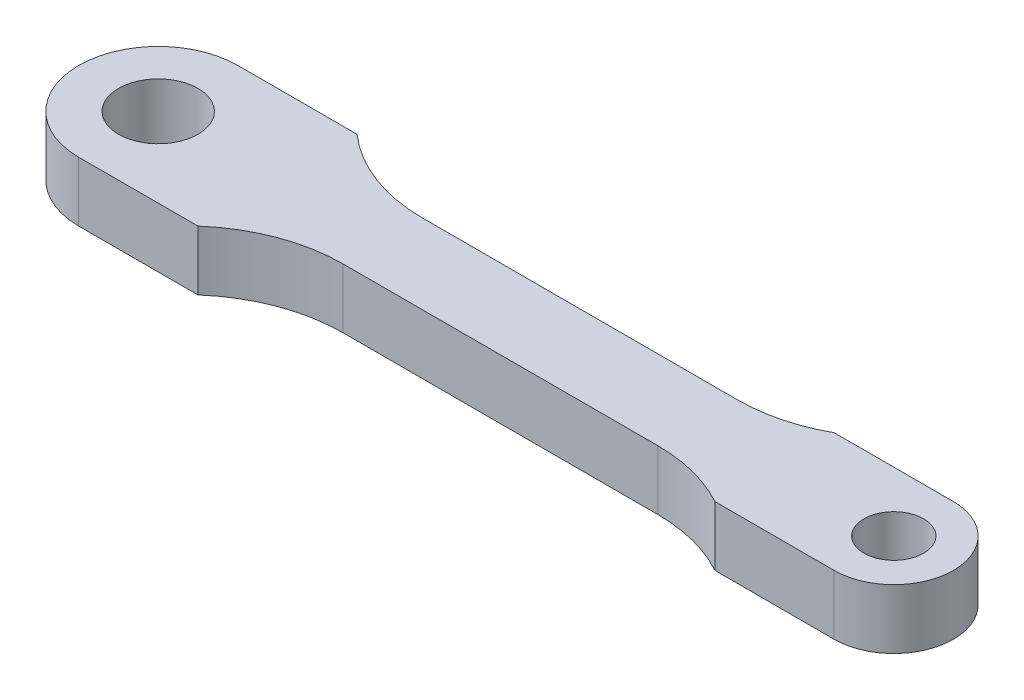
ISO-10303-21;
HEADER;
FILE_DESCRIPTION(('STEP AP214'),'2;1');
FILE_NAME('part.step','',(''),(''),'','','');
FILE_SCHEMA(('AUTOMOTIVE_DESIGN { 1 0 10303 214 1 1 1 1 }'));
ENDSEC;
DATA;
#1=APPLICATION_CONTEXT('core data for automotive mechanical design processes');
#2=APPLICATION_PROTOCOL_DEFINITION('international standard','automotive_design',2000,#1);
#3=PRODUCT_CONTEXT('',#1,'mechanical');
#4=PRODUCT('Part','Part','',(#3));
#5=PRODUCT_RELATED_PRODUCT_CATEGORY('part','',(#4));
#6=PRODUCT_DEFINITION_FORMATION('','',#4);
#7=PRODUCT_DEFINITION_CONTEXT('part definition',#1,'design');
#8=PRODUCT_DEFINITION('design','',#6,#7);
#9=PRODUCT_DEFINITION_SHAPE('','',#8);
#10=(LENGTH_UNIT() NAMED_UNIT(*) SI_UNIT(.MILLI.,.METRE.));
#11=(NAMED_UNIT(*) PLANE_ANGLE_UNIT() SI_UNIT($,.RADIAN.));
#12=(NAMED_UNIT(*) SI_UNIT($,.STERADIAN.) SOLID_ANGLE_UNIT());
#13=UNCERTAINTY_MEASURE_WITH_UNIT(LENGTH_MEASURE(1.E-05),#10,'distance_accuracy_value','');
#14=(GEOMETRIC_REPRESENTATION_CONTEXT(3) GLOBAL_UNCERTAINTY_ASSIGNED_CONTEXT((#13)) GLOBAL_UNIT_ASSIGNED_CONTEXT((#10,
#11,#12)) REPRESENTATION_CONTEXT('',''));
#15=CARTESIAN_POINT('',(0.,0.,0.));
#16=DIRECTION('',(0.,0.,1.));
#17=DIRECTION('',(1.,0.,0.));
#18=AXIS2_PLACEMENT_3D('',#15,#16,#17);
#19=CARTESIAN_POINT('',(0.841204780445638,2.25,4.5));
#20=DIRECTION('',(0.,0.,1.));
#21=DIRECTION('',(1.,0.,0.));
#22=AXIS2_PLACEMENT_3D('',#19,#20,#21);
#23=PLANE('',#22);
#24=DIRECTION('',(-1.,0.,0.));
#25=VECTOR('',#24,1.);
#26=CARTESIAN_POINT('',(0.841204780445638,-2.25,4.5));
#27=LINE('',#26,#25);
#28=CARTESIAN_POINT('',(28.5912047804456,-2.25,4.5));
#29=VERTEX_POINT('',#28);
#30=CARTESIAN_POINT('',(19.5912047804456,-2.25,4.5));
#31=VERTEX_POINT('',#30);
#32=EDGE_CURVE('E162',#29,#31,#27,.T.);
#33=ORIENTED_EDGE('',*,*,#32,.F.);
#34=DIRECTION('',(0.,-1.,0.));
#35=VECTOR('',#34,1.);
#36=CARTESIAN_POINT('',(28.5912047804456,2.25,4.5));
#37=LINE('',#36,#35);
#38=CARTESIAN_POINT('',(28.5912047804456,2.25,4.5));
#39=VERTEX_POINT('',#38);
#40=EDGE_CURVE('E11',#39,#29,#37,.T.);
#41=ORIENTED_EDGE('',*,*,#40,.F.);
#42=DIRECTION('',(-1.,0.,0.));
#43=VECTOR('',#42,1.);
#44=CARTESIAN_POINT('',(0.841204780445638,2.25,4.5));
#45=LINE('',#44,#43);
#46=CARTESIAN_POINT('',(19.5912047804456,2.25,4.5));
#47=VERTEX_POINT('',#46);
#48=EDGE_CURVE('E196',#39,#47,#45,.T.);
#49=ORIENTED_EDGE('',*,*,#48,.T.);
#50=DIRECTION('',(0.,-1.,0.));
#51=VECTOR('',#50,1.);
#52=CARTESIAN_POINT('',(19.5912047804456,2.25,4.5));
#53=LINE('',#52,#51);
#54=EDGE_CURVE('E53',#47,#31,#53,.T.);
#55=ORIENTED_EDGE('',*,*,#54,.T.);
#56=EDGE_LOOP('',(#33,#41,#49,#55));
#57=FACE_BOUND('',#56,.T.);
#58=ADVANCED_FACE('F37',(#57),#23,.T.);
#59=CARTESIAN_POINT('',(28.5912047804456,2.25,0.));
#60=DIRECTION('',(0.,-1.,0.));
#61=DIRECTION('',(0.,0.,-1.));
#62=AXIS2_PLACEMENT_3D('',#59,#60,#61);
#63=CYLINDRICAL_SURFACE('',#62,4.5);
#64=CARTESIAN_POINT('',(28.5912047804456,-2.25,0.));
#65=DIRECTION('',(0.,1.,0.));
#66=DIRECTION('',(0.,0.,1.));
#67=AXIS2_PLACEMENT_3D('',#64,#65,#66);
#68=CIRCLE('',#67,4.5);
#69=CARTESIAN_POINT('',(28.5912047804456,-2.25,-4.5));
#70=VERTEX_POINT('',#69);
#71=EDGE_CURVE('E164',#29,#70,#68,.T.);
#72=ORIENTED_EDGE('',*,*,#71,.T.);
#73=DIRECTION('',(0.,-1.,0.));
#74=VECTOR('',#73,1.);
#75=CARTESIAN_POINT('',(28.5912047804456,2.25,-4.5));
#76=LINE('',#75,#74);
#77=CARTESIAN_POINT('',(28.5912047804456,2.25,-4.5));
#78=VERTEX_POINT('',#77);
#79=EDGE_CURVE('E45',#78,#70,#76,.T.);
#80=ORIENTED_EDGE('',*,*,#79,.F.);
#81=CARTESIAN_POINT('',(28.5912047804456,2.25,0.));
#82=DIRECTION('',(0.,1.,0.));
#83=DIRECTION('',(0.,0.,1.));
#84=AXIS2_PLACEMENT_3D('',#81,#82,#83);
#85=CIRCLE('',#84,4.5);
#86=EDGE_CURVE('E239',#39,#78,#85,.T.);
#87=ORIENTED_EDGE('',*,*,#86,.F.);
#88=ORIENTED_EDGE('',*,*,#40,.T.);
#89=EDGE_LOOP('',(#72,#80,#87,#88));
#90=FACE_BOUND('',#89,.T.);
#91=ADVANCED_FACE('F274',(#90),#63,.T.);
#92=CARTESIAN_POINT('',(0.841204780445638,2.25,-4.5));
#93=DIRECTION('',(0.,0.,1.));
#94=DIRECTION('',(1.,0.,0.));
#95=AXIS2_PLACEMENT_3D('',#92,#93,#94);
#96=PLANE('',#95);
#97=DIRECTION('',(-1.,0.,0.));
#98=VECTOR('',#97,1.);
#99=CARTESIAN_POINT('',(0.841204780445638,-2.25,-4.5));
#100=LINE('',#99,#98);
#101=CARTESIAN_POINT('',(19.5912047804456,-2.25,-4.5));
#102=VERTEX_POINT('',#101);
#103=EDGE_CURVE('E166',#70,#102,#100,.T.);
#104=ORIENTED_EDGE('',*,*,#103,.T.);
#105=DIRECTION('',(0.,-1.,0.));
#106=VECTOR('',#105,1.);
#107=CARTESIAN_POINT('',(19.5912047804456,2.25,-4.5));
#108=LINE('',#107,#106);
#109=CARTESIAN_POINT('',(19.5912047804456,2.25,-4.5));
#110=VERTEX_POINT('',#109);
#111=EDGE_CURVE('E211',#110,#102,#108,.T.);
#112=ORIENTED_EDGE('',*,*,#111,.F.);
#113=DIRECTION('',(-1.,0.,0.));
#114=VECTOR('',#113,1.);
#115=CARTESIAN_POINT('',(0.841204780445638,2.25,-4.5));
#116=LINE('',#115,#114);
#117=EDGE_CURVE('E220',#78,#110,#116,.T.);
#118=ORIENTED_EDGE('',*,*,#117,.F.);
#119=ORIENTED_EDGE('',*,*,#79,.T.);
#120=EDGE_LOOP('',(#104,#112,#118,#119));
#121=FACE_BOUND('',#120,.T.);
#122=ADVANCED_FACE('F218',(#121),#96,.F.);
#123=CARTESIAN_POINT('',(13.7817297611345,2.25,-15.));
#124=DIRECTION('',(0.,-1.,0.));
#125=DIRECTION('',(0.,0.,-1.));
#126=AXIS2_PLACEMENT_3D('',#123,#124,#125);
#127=CYLINDRICAL_SURFACE('',#126,12.);
#128=CARTESIAN_POINT('',(13.7817297611345,-2.25,-15.));
#129=DIRECTION('',(0.,1.,0.));
#130=DIRECTION('',(0.,0.,1.));
#131=AXIS2_PLACEMENT_3D('',#128,#129,#130);
#132=CIRCLE('',#131,12.);
#133=CARTESIAN_POINT('',(13.7817297611345,-2.25,-3.));
#134=VERTEX_POINT('',#133);
#135=EDGE_CURVE('E168',#102,#134,#132,.F.);
#136=ORIENTED_EDGE('',*,*,#135,.T.);
#137=DIRECTION('',(0.,-1.,0.));
#138=VECTOR('',#137,1.);
#139=CARTESIAN_POINT('',(13.7817297611345,2.25,-3.));
#140=LINE('',#139,#138);
#141=CARTESIAN_POINT('',(13.7817297611345,2.25,-3.));
#142=VERTEX_POINT('',#141);
#143=EDGE_CURVE('E209',#142,#134,#140,.T.);
#144=ORIENTED_EDGE('',*,*,#143,.F.);
#145=CARTESIAN_POINT('',(13.7817297611345,2.25,-15.));
#146=DIRECTION('',(0.,1.,0.));
#147=DIRECTION('',(0.,0.,1.));
#148=AXIS2_PLACEMENT_3D('',#145,#146,#147);
#149=CIRCLE('',#148,12.);
#150=EDGE_CURVE('E233',#110,#142,#149,.F.);
#151=ORIENTED_EDGE('',*,*,#150,.F.);
#152=ORIENTED_EDGE('',*,*,#111,.T.);
#153=EDGE_LOOP('',(#136,#144,#151,#152));
#154=FACE_BOUND('',#153,.T.);
#155=ADVANCED_FACE('F230',(#154),#127,.F.);
#156=CARTESIAN_POINT('',(0.841204780445639,2.25,-3.));
#157=DIRECTION('',(0.,0.,-1.));
#158=DIRECTION('',(-1.,0.,0.));
#159=AXIS2_PLACEMENT_3D('',#156,#157,#158);
#160=PLANE('',#159);
#161=DIRECTION('',(1.,0.,0.));
#162=VECTOR('',#161,1.);
#163=CARTESIAN_POINT('',(0.841204780445639,-2.25,-3.));
#164=LINE('',#163,#162);
#165=CARTESIAN_POINT('',(-9.97154128636059,-2.25,-3.));
#166=VERTEX_POINT('',#165);
#167=EDGE_CURVE('E171',#166,#134,#164,.T.);
#168=ORIENTED_EDGE('',*,*,#167,.F.);
#169=DIRECTION('',(0.,-1.,0.));
#170=VECTOR('',#169,1.);
#171=CARTESIAN_POINT('',(-9.97154128636059,2.25,-3.));
#172=LINE('',#171,#170);
#173=CARTESIAN_POINT('',(-9.97154128636059,2.25,-3.));
#174=VERTEX_POINT('',#173);
#175=EDGE_CURVE('E207',#174,#166,#172,.T.);
#176=ORIENTED_EDGE('',*,*,#175,.F.);
#177=DIRECTION('',(1.,0.,0.));
#178=VECTOR('',#177,1.);
#179=CARTESIAN_POINT('',(0.841204780445639,2.25,-3.));
#180=LINE('',#179,#178);
#181=EDGE_CURVE('E235',#174,#142,#180,.T.);
#182=ORIENTED_EDGE('',*,*,#181,.T.);
#183=ORIENTED_EDGE('',*,*,#143,.T.);
#184=EDGE_LOOP('',(#168,#176,#182,#183));
#185=FACE_BOUND('',#184,.T.);
#186=ADVANCED_FACE('F285',(#185),#160,.T.);
#187=CARTESIAN_POINT('',(-9.97154128636059,2.25,-15.));
#188=DIRECTION('',(0.,-1.,0.));
#189=DIRECTION('',(0.,0.,-1.));
#190=AXIS2_PLACEMENT_3D('',#187,#188,#189);
#191=CYLINDRICAL_SURFACE('',#190,12.);
#192=CARTESIAN_POINT('',(-9.97154128636059,-2.25,-15.));
#193=DIRECTION('',(0.,1.,0.));
#194=DIRECTION('',(0.,0.,1.));
#195=AXIS2_PLACEMENT_3D('',#192,#193,#194);
#196=CIRCLE('',#195,12.);
#197=CARTESIAN_POINT('',(-17.9087952195544,-2.25,-6.));
#198=VERTEX_POINT('',#197);
#199=EDGE_CURVE('E174',#198,#166,#196,.T.);
#200=ORIENTED_EDGE('',*,*,#199,.F.);
#201=DIRECTION('',(0.,-1.,0.));
#202=VECTOR('',#201,1.);
#203=CARTESIAN_POINT('',(-17.9087952195544,2.25,-6.));
#204=LINE('',#203,#202);
#205=CARTESIAN_POINT('',(-17.9087952195544,2.25,-6.));
#206=VERTEX_POINT('',#205);
#207=EDGE_CURVE('E205',#206,#198,#204,.T.);
#208=ORIENTED_EDGE('',*,*,#207,.F.);
#209=CARTESIAN_POINT('',(-9.97154128636059,2.25,-15.));
#210=DIRECTION('',(0.,1.,0.));
#211=DIRECTION('',(0.,0.,1.));
#212=AXIS2_PLACEMENT_3D('',#209,#210,#211);
#213=CIRCLE('',#212,12.);
#214=EDGE_CURVE('E237',#206,#174,#213,.T.);
#215=ORIENTED_EDGE('',*,*,#214,.T.);
#216=ORIENTED_EDGE('',*,*,#175,.T.);
#217=EDGE_LOOP('',(#200,#208,#215,#216));
#218=FACE_BOUND('',#217,.T.);
#219=ADVANCED_FACE('F288',(#218),#191,.F.);
#220=CARTESIAN_POINT('',(0.841204780445639,2.25,-6.));
#221=DIRECTION('',(0.,0.,-1.));
#222=DIRECTION('',(-1.,0.,0.));
#223=AXIS2_PLACEMENT_3D('',#220,#221,#222);
#224=PLANE('',#223);
#225=DIRECTION('',(1.,0.,0.));
#226=VECTOR('',#225,1.);
#227=CARTESIAN_POINT('',(0.841204780445639,-2.25,-6.));
#228=LINE('',#227,#226);
#229=CARTESIAN_POINT('',(-26.9087952195544,-2.25,-6.));
#230=VERTEX_POINT('',#229);
#231=EDGE_CURVE('E177',#230,#198,#228,.T.);
#232=ORIENTED_EDGE('',*,*,#231,.F.);
#233=DIRECTION('',(0.,-1.,0.));
#234=VECTOR('',#233,1.);
#235=CARTESIAN_POINT('',(-26.9087952195544,2.25,-6.));
#236=LINE('',#235,#234);
#237=CARTESIAN_POINT('',(-26.9087952195544,2.25,-6.));
#238=VERTEX_POINT('',#237);
#239=EDGE_CURVE('E203',#238,#230,#236,.T.);
#240=ORIENTED_EDGE('',*,*,#239,.F.);
#241=DIRECTION('',(1.,0.,0.));
#242=VECTOR('',#241,1.);
#243=CARTESIAN_POINT('',(0.841204780445639,2.25,-6.));
#244=LINE('',#243,#242);
#245=EDGE_CURVE('E245',#238,#206,#244,.T.);
#246=ORIENTED_EDGE('',*,*,#245,.T.);
#247=ORIENTED_EDGE('',*,*,#207,.T.);
#248=EDGE_LOOP('',(#232,#240,#246,#247));
#249=FACE_BOUND('',#248,.T.);
#250=ADVANCED_FACE('F292',(#249),#224,.T.);
#251=CARTESIAN_POINT('',(-26.9087952195544,2.25,0.));
#252=DIRECTION('',(0.,-1.,0.));
#253=DIRECTION('',(0.,0.,-1.));
#254=AXIS2_PLACEMENT_3D('',#251,#252,#253);
#255=CYLINDRICAL_SURFACE('',#254,6.);
#256=CARTESIAN_POINT('',(-26.9087952195544,-2.25,0.));
#257=DIRECTION('',(0.,1.,0.));
#258=DIRECTION('',(0.,0.,1.));
#259=AXIS2_PLACEMENT_3D('',#256,#257,#258);
#260=CIRCLE('',#259,6.);
#261=CARTESIAN_POINT('',(-26.9087952195544,-2.25,6.));
#262=VERTEX_POINT('',#261);
#263=EDGE_CURVE('E180',#230,#262,#260,.T.);
#264=ORIENTED_EDGE('',*,*,#263,.T.);
#265=DIRECTION('',(0.,-1.,0.));
#266=VECTOR('',#265,1.);
#267=CARTESIAN_POINT('',(-26.9087952195544,2.25,6.));
#268=LINE('',#267,#266);
#269=CARTESIAN_POINT('',(-26.9087952195544,2.25,6.));
#270=VERTEX_POINT('',#269);
#271=EDGE_CURVE('E200',#270,#262,#268,.T.);
#272=ORIENTED_EDGE('',*,*,#271,.F.);
#273=CARTESIAN_POINT('',(-26.9087952195544,2.25,0.));
#274=DIRECTION('',(0.,1.,0.));
#275=DIRECTION('',(0.,0.,1.));
#276=AXIS2_PLACEMENT_3D('',#273,#274,#275);
#277=CIRCLE('',#276,6.);
#278=EDGE_CURVE('E248',#238,#270,#277,.T.);
#279=ORIENTED_EDGE('',*,*,#278,.F.);
#280=ORIENTED_EDGE('',*,*,#239,.T.);
#281=EDGE_LOOP('',(#264,#272,#279,#280));
#282=FACE_BOUND('',#281,.T.);
#283=ADVANCED_FACE('F254',(#282),#255,.T.);
#284=CARTESIAN_POINT('',(0.841204780445639,2.25,6.));
#285=DIRECTION('',(0.,0.,-1.));
#286=DIRECTION('',(-1.,0.,0.));
#287=AXIS2_PLACEMENT_3D('',#284,#285,#286);
#288=PLANE('',#287);
#289=DIRECTION('',(1.,0.,0.));
#290=VECTOR('',#289,1.);
#291=CARTESIAN_POINT('',(0.841204780445639,-2.25,6.));
#292=LINE('',#291,#290);
#293=CARTESIAN_POINT('',(-17.9087952195544,-2.25,6.));
#294=VERTEX_POINT('',#293);
#295=EDGE_CURVE('E182',#262,#294,#292,.T.);
#296=ORIENTED_EDGE('',*,*,#295,.T.);
#297=DIRECTION('',(0.,-1.,0.));
#298=VECTOR('',#297,1.);
#299=CARTESIAN_POINT('',(-17.9087952195544,2.25,6.));
#300=LINE('',#299,#298);
#301=CARTESIAN_POINT('',(-17.9087952195544,2.25,6.));
#302=VERTEX_POINT('',#301);
#303=EDGE_CURVE('E148',#302,#294,#300,.T.);
#304=ORIENTED_EDGE('',*,*,#303,.F.);
#305=DIRECTION('',(1.,0.,0.));
#306=VECTOR('',#305,1.);
#307=CARTESIAN_POINT('',(0.841204780445639,2.25,6.));
#308=LINE('',#307,#306);
#309=EDGE_CURVE('E136',#270,#302,#308,.T.);
#310=ORIENTED_EDGE('',*,*,#309,.F.);
#311=ORIENTED_EDGE('',*,*,#271,.T.);
#312=EDGE_LOOP('',(#296,#304,#310,#311));
#313=FACE_BOUND('',#312,.T.);
#314=ADVANCED_FACE('F258',(#313),#288,.F.);
#315=CARTESIAN_POINT('',(-9.97154128636059,2.25,15.));
#316=DIRECTION('',(0.,-1.,0.));
#317=DIRECTION('',(0.,0.,-1.));
#318=AXIS2_PLACEMENT_3D('',#315,#316,#317);
#319=CYLINDRICAL_SURFACE('',#318,12.);
#320=CARTESIAN_POINT('',(-9.97154128636059,-2.25,15.));
#321=DIRECTION('',(0.,1.,0.));
#322=DIRECTION('',(0.,0.,1.));
#323=AXIS2_PLACEMENT_3D('',#320,#321,#322);
#324=CIRCLE('',#323,12.);
#325=CARTESIAN_POINT('',(-9.97154128636059,-2.25,3.));
#326=VERTEX_POINT('',#325);
#327=EDGE_CURVE('E145',#294,#326,#324,.F.);
#328=ORIENTED_EDGE('',*,*,#327,.T.);
#329=DIRECTION('',(0.,-1.,0.));
#330=VECTOR('',#329,1.);
#331=CARTESIAN_POINT('',(-9.97154128636059,2.25,3.));
#332=LINE('',#331,#330);
#333=CARTESIAN_POINT('',(-9.97154128636059,2.25,3.));
#334=VERTEX_POINT('',#333);
#335=EDGE_CURVE('E142',#334,#326,#332,.T.);
#336=ORIENTED_EDGE('',*,*,#335,.F.);
#337=CARTESIAN_POINT('',(-9.97154128636059,2.25,15.));
#338=DIRECTION('',(0.,1.,0.));
#339=DIRECTION('',(0.,0.,1.));
#340=AXIS2_PLACEMENT_3D('',#337,#338,#339);
#341=CIRCLE('',#340,12.);
#342=EDGE_CURVE('E127',#302,#334,#341,.F.);
#343=ORIENTED_EDGE('',*,*,#342,.F.);
#344=ORIENTED_EDGE('',*,*,#303,.T.);
#345=EDGE_LOOP('',(#328,#336,#343,#344));
#346=FACE_BOUND('',#345,.T.);
#347=ADVANCED_FACE('F143',(#346),#319,.F.);
#348=CARTESIAN_POINT('',(0.841204780445639,2.25,3.));
#349=DIRECTION('',(0.,0.,-1.));
#350=DIRECTION('',(-1.,0.,0.));
#351=AXIS2_PLACEMENT_3D('',#348,#349,#350);
#352=PLANE('',#351);
#353=DIRECTION('',(1.,0.,0.));
#354=VECTOR('',#353,1.);
#355=CARTESIAN_POINT('',(0.841204780445639,-2.25,3.));
#356=LINE('',#355,#354);
#357=CARTESIAN_POINT('',(13.7817297611345,-2.25,3.));
#358=VERTEX_POINT('',#357);
#359=EDGE_CURVE('E185',#326,#358,#356,.T.);
#360=ORIENTED_EDGE('',*,*,#359,.T.);
#361=DIRECTION('',(0.,-1.,0.));
#362=VECTOR('',#361,1.);
#363=CARTESIAN_POINT('',(13.7817297611345,2.25,3.));
#364=LINE('',#363,#362);
#365=CARTESIAN_POINT('',(13.7817297611345,2.25,3.));
#366=VERTEX_POINT('',#365);
#367=EDGE_CURVE('E91',#366,#358,#364,.T.);
#368=ORIENTED_EDGE('',*,*,#367,.F.);
#369=DIRECTION('',(1.,0.,0.));
#370=VECTOR('',#369,1.);
#371=CARTESIAN_POINT('',(0.841204780445639,2.25,3.));
#372=LINE('',#371,#370);
#373=EDGE_CURVE('E134',#334,#366,#372,.T.);
#374=ORIENTED_EDGE('',*,*,#373,.F.);
#375=ORIENTED_EDGE('',*,*,#335,.T.);
#376=EDGE_LOOP('',(#360,#368,#374,#375));
#377=FACE_BOUND('',#376,.T.);
#378=ADVANCED_FACE('F150',(#377),#352,.F.);
#379=CARTESIAN_POINT('',(28.5912047804456,2.25,0.));
#380=DIRECTION('',(0.,-1.,0.));
#381=DIRECTION('',(0.,0.,-1.));
#382=AXIS2_PLACEMENT_3D('',#379,#380,#381);
#383=CYLINDRICAL_SURFACE('',#382,2.25);
#384=CARTESIAN_POINT('',(28.5912047804456,2.25,0.));
#385=DIRECTION('',(0.,1.,0.));
#386=DIRECTION('',(0.,0.,1.));
#387=AXIS2_PLACEMENT_3D('',#384,#385,#386);
#388=CIRCLE('',#387,2.25);
#389=CARTESIAN_POINT('',(28.5912047804456,2.25,2.25));
#390=VERTEX_POINT('',#389);
#391=EDGE_CURVE('E153',#390,#390,#388,.T.);
#392=ORIENTED_EDGE('',*,*,#391,.T.);
#393=EDGE_LOOP('',(#392));
#394=FACE_BOUND('',#393,.T.);
#395=CARTESIAN_POINT('',(28.5912047804456,-2.25,0.));
#396=DIRECTION('',(0.,1.,0.));
#397=DIRECTION('',(0.,0.,1.));
#398=AXIS2_PLACEMENT_3D('',#395,#396,#397);
#399=CIRCLE('',#398,2.25);
#400=CARTESIAN_POINT('',(28.5912047804456,-2.25,2.25));
#401=VERTEX_POINT('',#400);
#402=EDGE_CURVE('E190',#401,#401,#399,.T.);
#403=ORIENTED_EDGE('',*,*,#402,.F.);
#404=EDGE_LOOP('',(#403));
#405=FACE_BOUND('',#404,.T.);
#406=ADVANCED_FACE('F262',(#394,#405),#383,.F.);
#407=CARTESIAN_POINT('',(13.7817297611345,2.25,15.));
#408=DIRECTION('',(0.,-1.,0.));
#409=DIRECTION('',(0.,0.,-1.));
#410=AXIS2_PLACEMENT_3D('',#407,#408,#409);
#411=CYLINDRICAL_SURFACE('',#410,12.);
#412=CARTESIAN_POINT('',(13.7817297611345,-2.25,15.));
#413=DIRECTION('',(0.,1.,0.));
#414=DIRECTION('',(0.,0.,1.));
#415=AXIS2_PLACEMENT_3D('',#412,#413,#414);
#416=CIRCLE('',#415,12.);
#417=EDGE_CURVE('E187',#31,#358,#416,.T.);
#418=ORIENTED_EDGE('',*,*,#417,.F.);
#419=ORIENTED_EDGE('',*,*,#54,.F.);
#420=CARTESIAN_POINT('',(13.7817297611345,2.25,15.));
#421=DIRECTION('',(0.,1.,0.));
#422=DIRECTION('',(0.,0.,1.));
#423=AXIS2_PLACEMENT_3D('',#420,#421,#422);
#424=CIRCLE('',#423,12.);
#425=EDGE_CURVE('E151',#47,#366,#424,.T.);
#426=ORIENTED_EDGE('',*,*,#425,.T.);
#427=ORIENTED_EDGE('',*,*,#367,.T.);
#428=EDGE_LOOP('',(#418,#419,#426,#427));
#429=FACE_BOUND('',#428,.T.);
#430=ADVANCED_FACE('F259',(#429),#411,.F.);
#431=CARTESIAN_POINT('',(-26.9087952195544,2.25,0.));
#432=DIRECTION('',(0.,-1.,0.));
#433=DIRECTION('',(0.,0.,-1.));
#434=AXIS2_PLACEMENT_3D('',#431,#432,#433);
#435=CYLINDRICAL_SURFACE('',#434,3.);
#436=CARTESIAN_POINT('',(-26.9087952195544,2.25,0.));
#437=DIRECTION('',(0.,1.,0.));
#438=DIRECTION('',(0.,0.,1.));
#439=AXIS2_PLACEMENT_3D('',#436,#437,#438);
#440=CIRCLE('',#439,3.);
#441=CARTESIAN_POINT('',(-26.9087952195544,2.25,3.));
#442=VERTEX_POINT('',#441);
#443=EDGE_CURVE('E159',#442,#442,#440,.T.);
#444=ORIENTED_EDGE('',*,*,#443,.T.);
#445=EDGE_LOOP('',(#444));
#446=FACE_BOUND('',#445,.T.);
#447=CARTESIAN_POINT('',(-26.9087952195544,-2.25,0.));
#448=DIRECTION('',(0.,1.,0.));
#449=DIRECTION('',(0.,0.,1.));
#450=AXIS2_PLACEMENT_3D('',#447,#448,#449);
#451=CIRCLE('',#450,3.);
#452=CARTESIAN_POINT('',(-26.9087952195544,-2.25,3.));
#453=VERTEX_POINT('',#452);
#454=EDGE_CURVE('E193',#453,#453,#451,.T.);
#455=ORIENTED_EDGE('',*,*,#454,.F.);
#456=EDGE_LOOP('',(#455));
#457=FACE_BOUND('',#456,.T.);
#458=ADVANCED_FACE('F261',(#446,#457),#435,.F.);
#459=CARTESIAN_POINT('',(0.841204780445639,2.25,0.));
#460=DIRECTION('',(0.,1.,0.));
#461=DIRECTION('',(0.,0.,1.));
#462=AXIS2_PLACEMENT_3D('',#459,#460,#461);
#463=PLANE('',#462);
#464=ORIENTED_EDGE('',*,*,#48,.F.);
#465=ORIENTED_EDGE('',*,*,#86,.T.);
#466=ORIENTED_EDGE('',*,*,#117,.T.);
#467=ORIENTED_EDGE('',*,*,#150,.T.);
#468=ORIENTED_EDGE('',*,*,#181,.F.);
#469=ORIENTED_EDGE('',*,*,#214,.F.);
#470=ORIENTED_EDGE('',*,*,#245,.F.);
#471=ORIENTED_EDGE('',*,*,#278,.T.);
#472=ORIENTED_EDGE('',*,*,#309,.T.);
#473=ORIENTED_EDGE('',*,*,#342,.T.);
#474=ORIENTED_EDGE('',*,*,#373,.T.);
#475=ORIENTED_EDGE('',*,*,#425,.F.);
#476=EDGE_LOOP('',(#464,#465,#466,#467,#468,#469,#470,#471,#472,#473,#474,#475));
#477=FACE_BOUND('',#476,.T.);
#478=ORIENTED_EDGE('',*,*,#391,.F.);
#479=EDGE_LOOP('',(#478));
#480=FACE_BOUND('',#479,.T.);
#481=ORIENTED_EDGE('',*,*,#443,.F.);
#482=EDGE_LOOP('',(#481));
#483=FACE_BOUND('',#482,.T.);
#484=ADVANCED_FACE('F130',(#477,#480,#483),#463,.T.);
#485=CARTESIAN_POINT('',(0.841204780445639,-2.25,0.));
#486=DIRECTION('',(0.,1.,0.));
#487=DIRECTION('',(0.,0.,1.));
#488=AXIS2_PLACEMENT_3D('',#485,#486,#487);
#489=PLANE('',#488);
#490=ORIENTED_EDGE('',*,*,#32,.T.);
#491=ORIENTED_EDGE('',*,*,#417,.T.);
#492=ORIENTED_EDGE('',*,*,#359,.F.);
#493=ORIENTED_EDGE('',*,*,#327,.F.);
#494=ORIENTED_EDGE('',*,*,#295,.F.);
#495=ORIENTED_EDGE('',*,*,#263,.F.);
#496=ORIENTED_EDGE('',*,*,#231,.T.);
#497=ORIENTED_EDGE('',*,*,#199,.T.);
#498=ORIENTED_EDGE('',*,*,#167,.T.);
#499=ORIENTED_EDGE('',*,*,#135,.F.);
#500=ORIENTED_EDGE('',*,*,#103,.F.);
#501=ORIENTED_EDGE('',*,*,#71,.F.);
#502=EDGE_LOOP('',(#490,#491,#492,#493,#494,#495,#496,#497,#498,#499,#500,#501));
#503=FACE_BOUND('',#502,.T.);
#504=ORIENTED_EDGE('',*,*,#402,.T.);
#505=EDGE_LOOP('',(#504));
#506=FACE_BOUND('',#505,.T.);
#507=ORIENTED_EDGE('',*,*,#454,.T.);
#508=EDGE_LOOP('',(#507));
#509=FACE_BOUND('',#508,.T.);
#510=ADVANCED_FACE('F225',(#503,#506,#509),#489,.F.);
#511=CLOSED_SHELL('',(#58,#91,#122,#155,#186,#219,#250,#283,#314,#347,#378,#406,#430,#458,#484,#510));
#512=MANIFOLD_SOLID_BREP('B2',#511);
#513=ADVANCED_BREP_SHAPE_REPRESENTATION('',(#18,#512),#14);
#514=SHAPE_DEFINITION_REPRESENTATION(#9,#513);
ENDSEC;
END-ISO-10303-21;
